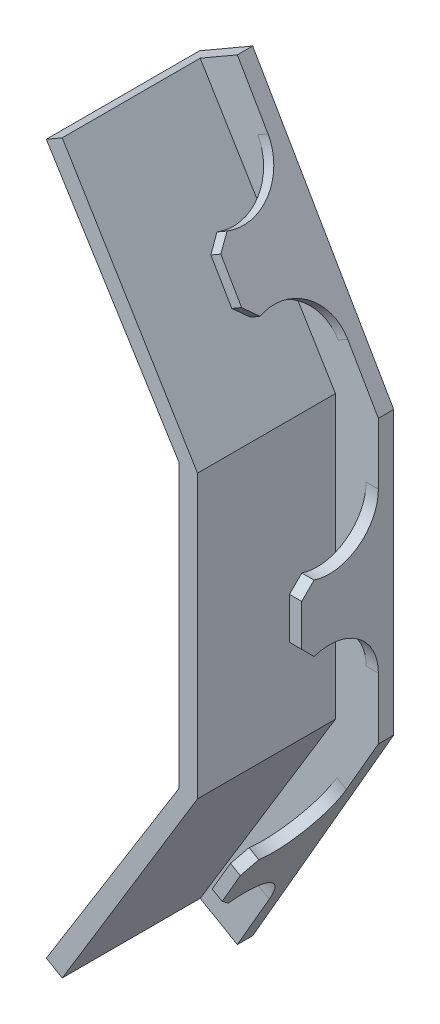
ISO-10303-21;
HEADER;
FILE_DESCRIPTION(('STEP AP214'),'2;1');
FILE_NAME('part.step','',(''),(''),'','','');
FILE_SCHEMA(('AUTOMOTIVE_DESIGN { 1 0 10303 214 1 1 1 1 }'));
ENDSEC;
DATA;
#1=APPLICATION_CONTEXT('core data for automotive mechanical design processes');
#2=APPLICATION_PROTOCOL_DEFINITION('international standard','automotive_design',2000,#1);
#3=PRODUCT_CONTEXT('',#1,'mechanical');
#4=PRODUCT('Part','Part','',(#3));
#5=PRODUCT_RELATED_PRODUCT_CATEGORY('part','',(#4));
#6=PRODUCT_DEFINITION_FORMATION('','',#4);
#7=PRODUCT_DEFINITION_CONTEXT('part definition',#1,'design');
#8=PRODUCT_DEFINITION('design','',#6,#7);
#9=PRODUCT_DEFINITION_SHAPE('','',#8);
#10=(LENGTH_UNIT() NAMED_UNIT(*) SI_UNIT(.MILLI.,.METRE.));
#11=(NAMED_UNIT(*) PLANE_ANGLE_UNIT() SI_UNIT($,.RADIAN.));
#12=(NAMED_UNIT(*) SI_UNIT($,.STERADIAN.) SOLID_ANGLE_UNIT());
#13=UNCERTAINTY_MEASURE_WITH_UNIT(LENGTH_MEASURE(1.E-05),#10,'distance_accuracy_value','');
#14=(GEOMETRIC_REPRESENTATION_CONTEXT(3) GLOBAL_UNCERTAINTY_ASSIGNED_CONTEXT((#13)) GLOBAL_UNIT_ASSIGNED_CONTEXT((#10,
#11,#12)) REPRESENTATION_CONTEXT('',''));
#15=CARTESIAN_POINT('',(0.,0.,0.));
#16=DIRECTION('',(0.,0.,1.));
#17=DIRECTION('',(1.,0.,0.));
#18=AXIS2_PLACEMENT_3D('',#15,#16,#17);
#19=CARTESIAN_POINT('',(0.,0.,25.));
#20=DIRECTION('',(0.866025403784438,-0.500000000000001,0.));
#21=DIRECTION('',(0.500000000000001,0.866025403784438,0.));
#22=AXIS2_PLACEMENT_3D('',#19,#20,#21);
#23=PLANE('',#22);
#24=DIRECTION('',(0.500000000000001,0.866025403784438,0.));
#25=VECTOR('',#24,1.);
#26=CARTESIAN_POINT('',(0.,0.,2.5));
#27=LINE('',#26,#25);
#28=CARTESIAN_POINT('',(-5.21209125149789,-9.02760686127958,2.5));
#29=VERTEX_POINT('',#28);
#30=CARTESIAN_POINT('',(0.,0.,2.5));
#31=VERTEX_POINT('',#30);
#32=EDGE_CURVE('E236',#29,#31,#27,.T.);
#33=ORIENTED_EDGE('',*,*,#32,.F.);
#34=CARTESIAN_POINT('',(-5.2120912514979,-9.02760686127957,10.5));
#35=DIRECTION('',(0.866025403784438,-0.500000000000001,0.));
#36=DIRECTION('',(0.500000000000001,0.866025403784438,0.));
#37=AXIS2_PLACEMENT_3D('',#34,#35,#36);
#38=CIRCLE('',#37,8.);
#39=CARTESIAN_POINT('',(-9.01361981272945,-15.6120474757568,12.9886788448016));
#40=VERTEX_POINT('',#39);
#41=EDGE_CURVE('E248',#29,#40,#38,.F.);
#42=ORIENTED_EDGE('',*,*,#41,.T.);
#43=DIRECTION('',(-0.353553390593275,-0.612372435695795,0.707106781186547));
#44=VECTOR('',#43,1.);
#45=CARTESIAN_POINT('',(-1.2596401951643,-2.18176081728054,-2.5192803903286));
#46=LINE('',#45,#44);
#47=CARTESIAN_POINT('',(-10.0192803903286,-17.3539026913277,15.));
#48=VERTEX_POINT('',#47);
#49=EDGE_CURVE('E246',#40,#48,#46,.T.);
#50=ORIENTED_EDGE('',*,*,#49,.T.);
#51=DIRECTION('',(0.500000000000001,0.866025403784438,0.));
#52=VECTOR('',#51,1.);
#53=CARTESIAN_POINT('',(0.,0.,15.));
#54=LINE('',#53,#52);
#55=CARTESIAN_POINT('',(-12.9807196096714,-22.4832658827565,15.));
#56=VERTEX_POINT('',#55);
#57=EDGE_CURVE('E275',#56,#48,#54,.T.);
#58=ORIENTED_EDGE('',*,*,#57,.F.);
#59=DIRECTION('',(0.353553390593275,0.612372435695795,0.707106781186547));
#60=VECTOR('',#59,1.);
#61=CARTESIAN_POINT('',(-10.2403598048357,-17.7368234697615,20.4807196096714));
#62=LINE('',#61,#60);
#63=CARTESIAN_POINT('',(-13.9863801872706,-24.2251210983273,12.9886788448016));
#64=VERTEX_POINT('',#63);
#65=EDGE_CURVE('E267',#64,#56,#62,.T.);
#66=ORIENTED_EDGE('',*,*,#65,.F.);
#67=CARTESIAN_POINT('',(-17.7879087485022,-30.8095617128046,10.5));
#68=DIRECTION('',(0.866025403784438,-0.500000000000001,0.));
#69=DIRECTION('',(0.500000000000001,0.866025403784438,0.));
#70=AXIS2_PLACEMENT_3D('',#67,#68,#69);
#71=CIRCLE('',#70,8.);
#72=CARTESIAN_POINT('',(-17.7879087485022,-30.8095617128046,2.49999999999999));
#73=VERTEX_POINT('',#72);
#74=EDGE_CURVE('E262',#73,#64,#71,.T.);
#75=ORIENTED_EDGE('',*,*,#74,.F.);
#76=DIRECTION('',(-0.500000000000001,-0.866025403784438,0.));
#77=VECTOR('',#76,1.);
#78=CARTESIAN_POINT('',(0.,0.,2.49999999999996));
#79=LINE('',#78,#77);
#80=CARTESIAN_POINT('',(-23.0000000000001,-39.8371685740841,2.5));
#81=VERTEX_POINT('',#80);
#82=EDGE_CURVE('E261',#73,#81,#79,.T.);
#83=ORIENTED_EDGE('',*,*,#82,.T.);
#84=DIRECTION('',(0.,0.,-1.));
#85=VECTOR('',#84,1.);
#86=CARTESIAN_POINT('',(-23.0000000000001,-39.8371685740841,25.));
#87=LINE('',#86,#85);
#88=CARTESIAN_POINT('',(-23.0000000000001,-39.8371685740841,0.));
#89=VERTEX_POINT('',#88);
#90=EDGE_CURVE('E421',#81,#89,#87,.T.);
#91=ORIENTED_EDGE('',*,*,#90,.T.);
#92=DIRECTION('',(-0.500000000000001,-0.866025403784438,0.));
#93=VECTOR('',#92,1.);
#94=CARTESIAN_POINT('',(0.,0.,0.));
#95=LINE('',#94,#93);
#96=CARTESIAN_POINT('',(0.,0.,0.));
#97=VERTEX_POINT('',#96);
#98=EDGE_CURVE('E405',#97,#89,#95,.T.);
#99=ORIENTED_EDGE('',*,*,#98,.F.);
#100=DIRECTION('',(0.,0.,-1.));
#101=VECTOR('',#100,1.);
#102=CARTESIAN_POINT('',(0.,0.,25.));
#103=LINE('',#102,#101);
#104=EDGE_CURVE('E257',#31,#97,#103,.T.);
#105=ORIENTED_EDGE('',*,*,#104,.F.);
#106=EDGE_LOOP('',(#33,#42,#50,#58,#66,#75,#83,#91,#99,#105));
#107=FACE_BOUND('',#106,.T.);
#108=ADVANCED_FACE('F39',(#107),#23,.T.);
#109=CARTESIAN_POINT('',(-24.7320508075689,-38.8371685740841,2.5));
#110=DIRECTION('',(0.86303289117112,-0.505147729636407,0.));
#111=DIRECTION('',(0.505147729636407,0.863032891171121,0.));
#112=AXIS2_PLACEMENT_3D('',#109,#110,#111);
#113=PLANE('',#112);
#114=CARTESIAN_POINT('',(-6.76068878839782,-8.13352365648401,10.5));
#115=DIRECTION('',(0.86303289117112,-0.505147729636407,0.));
#116=DIRECTION('',(0.505147729636407,0.863032891171121,0.));
#117=AXIS2_PLACEMENT_3D('',#114,#115,#116);
#118=ELLIPSE('',#117,8.00014181952266,8.);
#119=CARTESIAN_POINT('',(-6.76068878839782,-8.13352365648401,2.5));
#120=VERTEX_POINT('',#119);
#121=CARTESIAN_POINT('',(-10.6014239173018,-14.6953283485616,12.9886788448016));
#122=VERTEX_POINT('',#121);
#123=EDGE_CURVE('E286',#120,#122,#118,.F.);
#124=ORIENTED_EDGE('',*,*,#123,.F.);
#125=DIRECTION('',(0.505147729636407,0.863032891171121,0.));
#126=VECTOR('',#125,1.);
#127=CARTESIAN_POINT('',(-24.7320508075689,-38.8371685740841,2.5));
#128=LINE('',#127,#126);
#129=CARTESIAN_POINT('',(-19.4662053345585,-29.8405967270649,2.49999999999999));
#130=VERTEX_POINT('',#129);
#131=EDGE_CURVE('E245',#130,#120,#128,.T.);
#132=ORIENTED_EDGE('',*,*,#131,.F.);
#133=CARTESIAN_POINT('',(-19.4662053345585,-29.8405967270649,10.5));
#134=DIRECTION('',(0.86303289117112,-0.505147729636407,0.));
#135=DIRECTION('',(0.505147729636407,0.863032891171121,0.));
#136=AXIS2_PLACEMENT_3D('',#133,#134,#135);
#137=ELLIPSE('',#136,8.00014181952266,8.);
#138=CARTESIAN_POINT('',(-15.6254702056545,-23.2787920349874,12.9886788448016));
#139=VERTEX_POINT('',#138);
#140=EDGE_CURVE('E280',#130,#139,#137,.T.);
#141=ORIENTED_EDGE('',*,*,#140,.T.);
#142=DIRECTION('',(0.357196551147009,0.61026181880426,0.707100513617688));
#143=VECTOR('',#142,1.);
#144=CARTESIAN_POINT('',(-22.8280073763306,-35.5841556216954,-1.26934720942954));
#145=LINE('',#144,#143);
#146=CARTESIAN_POINT('',(-14.6094378792032,-21.5429249514082,15.));
#147=VERTEX_POINT('',#146);
#148=EDGE_CURVE('E469',#139,#147,#145,.T.);
#149=ORIENTED_EDGE('',*,*,#148,.T.);
#150=DIRECTION('',(0.505147729636407,0.863032891171121,0.));
#151=VECTOR('',#150,1.);
#152=CARTESIAN_POINT('',(-24.7320508075689,-38.8371685740841,15.));
#153=LINE('',#152,#151);
#154=CARTESIAN_POINT('',(-11.6174562437531,-16.4311954321407,15.));
#155=VERTEX_POINT('',#154);
#156=EDGE_CURVE('E46',#147,#155,#153,.T.);
#157=ORIENTED_EDGE('',*,*,#156,.T.);
#158=DIRECTION('',(-0.357196551147009,-0.61026181880426,0.707100513617688));
#159=VECTOR('',#158,1.);
#160=CARTESIAN_POINT('',(-15.0176964589955,-22.2404250326561,21.7310605180841));
#161=LINE('',#160,#159);
#162=EDGE_CURVE('E11',#122,#155,#161,.T.);
#163=ORIENTED_EDGE('',*,*,#162,.F.);
#164=EDGE_LOOP('',(#124,#132,#141,#149,#157,#163));
#165=FACE_BOUND('',#164,.T.);
#166=ADVANCED_FACE('F471',(#165),#113,.F.);
#167=CARTESIAN_POINT('',(-24.7320508075689,84.8371685740841,2.5));
#168=DIRECTION('',(0.86303289117112,0.505147729636407,0.));
#169=DIRECTION('',(-0.505147729636407,0.863032891171121,0.));
#170=AXIS2_PLACEMENT_3D('',#167,#168,#169);
#171=PLANE('',#170);
#172=CARTESIAN_POINT('',(-19.6804839614425,76.2066866687321,10.5));
#173=DIRECTION('',(0.86303289117112,0.505147729636407,0.));
#174=DIRECTION('',(0.505147729636407,-0.863032891171121,0.));
#175=AXIS2_PLACEMENT_3D('',#172,#173,#174);
#176=ELLIPSE('',#175,8.00014181952265,7.99999999999999);
#177=CARTESIAN_POINT('',(-19.6804839614425,76.2066866687321,2.49999999999999));
#178=VERTEX_POINT('',#177);
#179=CARTESIAN_POINT('',(-15.8397488325385,69.6448819766546,12.9886788448016));
#180=VERTEX_POINT('',#179);
#181=EDGE_CURVE('E321',#178,#180,#176,.F.);
#182=ORIENTED_EDGE('',*,*,#181,.F.);
#183=DIRECTION('',(-0.505147729636407,0.863032891171121,0.));
#184=VECTOR('',#183,1.);
#185=CARTESIAN_POINT('',(-24.7320508075689,84.8371685740841,2.5));
#186=LINE('',#185,#184);
#187=CARTESIAN_POINT('',(-6.5464101615138,53.7674337148168,2.5));
#188=VERTEX_POINT('',#187);
#189=EDGE_CURVE('E372',#188,#178,#186,.T.);
#190=ORIENTED_EDGE('',*,*,#189,.F.);
#191=CARTESIAN_POINT('',(-6.5464101615138,53.7674337148168,10.5));
#192=DIRECTION('',(0.86303289117112,0.505147729636407,0.));
#193=DIRECTION('',(0.505147729636407,-0.863032891171121,0.));
#194=AXIS2_PLACEMENT_3D('',#191,#192,#193);
#195=ELLIPSE('',#194,8.00014181952266,8.);
#196=CARTESIAN_POINT('',(-10.3871452904178,60.3292384068944,12.9886788448016));
#197=VERTEX_POINT('',#196);
#198=EDGE_CURVE('E309',#188,#197,#195,.T.);
#199=ORIENTED_EDGE('',*,*,#198,.T.);
#200=DIRECTION('',(-0.357196551147009,0.610261818804259,0.70710051361769));
#201=VECTOR('',#200,1.);
#202=CARTESIAN_POINT('',(-14.9105590448424,68.0573833067125,21.9431555293836));
#203=LINE('',#202,#201);
#204=CARTESIAN_POINT('',(-11.4031776168691,62.0651054904735,15.));
#205=VERTEX_POINT('',#204);
#206=EDGE_CURVE('E450',#197,#205,#203,.T.);
#207=ORIENTED_EDGE('',*,*,#206,.T.);
#208=DIRECTION('',(-0.505147729636407,0.863032891171121,0.));
#209=VECTOR('',#208,1.);
#210=CARTESIAN_POINT('',(-24.7320508075689,84.8371685740841,15.));
#211=LINE('',#210,#209);
#212=CARTESIAN_POINT('',(-14.8237165060872,67.9090148930754,15.));
#213=VERTEX_POINT('',#212);
#214=EDGE_CURVE('E461',#205,#213,#211,.T.);
#215=ORIENTED_EDGE('',*,*,#214,.T.);
#216=DIRECTION('',(0.35719655114701,-0.610261818804261,0.707100513617687));
#217=VECTOR('',#216,1.);
#218=CARTESIAN_POINT('',(-22.9351447904837,81.767197347639,-1.05725219812995));
#219=LINE('',#218,#217);
#220=EDGE_CURVE('E466',#180,#213,#219,.T.);
#221=ORIENTED_EDGE('',*,*,#220,.F.);
#222=EDGE_LOOP('',(#182,#190,#199,#207,#215,#221));
#223=FACE_BOUND('',#222,.T.);
#224=ADVANCED_FACE('F503',(#223),#171,.F.);
#225=CARTESIAN_POINT('',(0.,0.,25.));
#226=DIRECTION('',(-1.,0.,0.));
#227=DIRECTION('',(0.,0.,1.));
#228=AXIS2_PLACEMENT_3D('',#225,#226,#227);
#229=PLANE('',#228);
#230=CARTESIAN_POINT('',(0.,36.,10.5));
#231=DIRECTION('',(1.,0.,0.));
#232=DIRECTION('',(0.,0.,1.));
#233=AXIS2_PLACEMENT_3D('',#230,#231,#232);
#234=CIRCLE('',#233,8.);
#235=CARTESIAN_POINT('',(0.,28.3969428775369,12.9886788448016));
#236=VERTEX_POINT('',#235);
#237=CARTESIAN_POINT('',(0.,36.,2.5));
#238=VERTEX_POINT('',#237);
#239=EDGE_CURVE('E323',#236,#238,#234,.T.);
#240=ORIENTED_EDGE('',*,*,#239,.F.);
#241=DIRECTION('',(0.,0.707106781186547,-0.707106781186547));
#242=VECTOR('',#241,1.);
#243=CARTESIAN_POINT('',(0.,28.3969428775369,12.9886788448016));
#244=LINE('',#243,#242);
#245=CARTESIAN_POINT('',(0.,26.3856217223385,15.));
#246=VERTEX_POINT('',#245);
#247=EDGE_CURVE('E327',#246,#236,#244,.T.);
#248=ORIENTED_EDGE('',*,*,#247,.F.);
#249=DIRECTION('',(0.,1.,0.));
#250=VECTOR('',#249,1.);
#251=CARTESIAN_POINT('',(0.,19.6143782776615,15.));
#252=LINE('',#251,#250);
#253=CARTESIAN_POINT('',(0.,19.6143782776615,15.));
#254=VERTEX_POINT('',#253);
#255=EDGE_CURVE('E354',#254,#246,#252,.T.);
#256=ORIENTED_EDGE('',*,*,#255,.F.);
#257=DIRECTION('',(0.,0.707106781186547,0.707106781186547));
#258=VECTOR('',#257,1.);
#259=CARTESIAN_POINT('',(0.,17.6030571224631,12.9886788448016));
#260=LINE('',#259,#258);
#261=CARTESIAN_POINT('',(0.,17.6030571224631,12.9886788448016));
#262=VERTEX_POINT('',#261);
#263=EDGE_CURVE('E353',#262,#254,#260,.T.);
#264=ORIENTED_EDGE('',*,*,#263,.F.);
#265=CARTESIAN_POINT('',(0.,10.,10.5));
#266=DIRECTION('',(1.,0.,0.));
#267=DIRECTION('',(0.,0.,-1.));
#268=AXIS2_PLACEMENT_3D('',#265,#266,#267);
#269=CIRCLE('',#268,8.);
#270=CARTESIAN_POINT('',(0.,10.,2.5));
#271=VERTEX_POINT('',#270);
#272=EDGE_CURVE('E346',#271,#262,#269,.T.);
#273=ORIENTED_EDGE('',*,*,#272,.F.);
#274=DIRECTION('',(0.,1.,0.));
#275=VECTOR('',#274,1.);
#276=CARTESIAN_POINT('',(0.,0.,2.5));
#277=LINE('',#276,#275);
#278=EDGE_CURVE('E347',#31,#271,#277,.T.);
#279=ORIENTED_EDGE('',*,*,#278,.F.);
#280=ORIENTED_EDGE('',*,*,#104,.T.);
#281=DIRECTION('',(0.,1.,0.));
#282=VECTOR('',#281,1.);
#283=CARTESIAN_POINT('',(0.,0.,0.));
#284=LINE('',#283,#282);
#285=CARTESIAN_POINT('',(0.,46.,0.));
#286=VERTEX_POINT('',#285);
#287=EDGE_CURVE('E412',#97,#286,#284,.T.);
#288=ORIENTED_EDGE('',*,*,#287,.T.);
#289=DIRECTION('',(0.,0.,-1.));
#290=VECTOR('',#289,1.);
#291=CARTESIAN_POINT('',(0.,46.,25.));
#292=LINE('',#291,#290);
#293=CARTESIAN_POINT('',(0.,46.,2.5));
#294=VERTEX_POINT('',#293);
#295=EDGE_CURVE('E446',#294,#286,#292,.T.);
#296=ORIENTED_EDGE('',*,*,#295,.F.);
#297=DIRECTION('',(0.,1.,0.));
#298=VECTOR('',#297,1.);
#299=CARTESIAN_POINT('',(0.,36.,2.5));
#300=LINE('',#299,#298);
#301=EDGE_CURVE('E344',#238,#294,#300,.T.);
#302=ORIENTED_EDGE('',*,*,#301,.F.);
#303=EDGE_LOOP('',(#240,#248,#256,#264,#273,#279,#280,#288,#296,#302));
#304=FACE_BOUND('',#303,.T.);
#305=ADVANCED_FACE('F507',(#304),#229,.F.);
#306=CARTESIAN_POINT('',(-23.0000000000001,-39.8371685740841,25.));
#307=DIRECTION('',(-0.5,-0.866025403784438,0.));
#308=DIRECTION('',(0.866025403784439,-0.5,0.));
#309=AXIS2_PLACEMENT_3D('',#306,#307,#308);
#310=PLANE('',#309);
#311=ORIENTED_EDGE('',*,*,#90,.F.);
#312=DIRECTION('',(0.866025403784438,-0.5,0.));
#313=VECTOR('',#312,1.);
#314=CARTESIAN_POINT('',(-24.7320508075689,-38.8371685740841,2.5));
#315=LINE('',#314,#313);
#316=CARTESIAN_POINT('',(-29.0621778264911,-36.3371685740841,2.5));
#317=VERTEX_POINT('',#316);
#318=EDGE_CURVE('E388',#317,#81,#315,.T.);
#319=ORIENTED_EDGE('',*,*,#318,.F.);
#320=DIRECTION('',(0.,0.,1.));
#321=VECTOR('',#320,1.);
#322=CARTESIAN_POINT('',(-29.0621778264911,-36.3371685740841,2.5));
#323=LINE('',#322,#321);
#324=CARTESIAN_POINT('',(-29.0621778264911,-36.3371685740841,25.));
#325=VERTEX_POINT('',#324);
#326=EDGE_CURVE('E398',#317,#325,#323,.T.);
#327=ORIENTED_EDGE('',*,*,#326,.T.);
#328=DIRECTION('',(-0.866025403784438,0.5,0.));
#329=VECTOR('',#328,1.);
#330=CARTESIAN_POINT('',(-23.0000000000001,-39.8371685740841,25.));
#331=LINE('',#330,#329);
#332=CARTESIAN_POINT('',(-31.6602540378444,-34.8371685740842,25.));
#333=VERTEX_POINT('',#332);
#334=EDGE_CURVE('E409',#325,#333,#331,.T.);
#335=ORIENTED_EDGE('',*,*,#334,.T.);
#336=DIRECTION('',(0.,0.,-1.));
#337=VECTOR('',#336,1.);
#338=CARTESIAN_POINT('',(-31.6602540378444,-34.8371685740842,25.));
#339=LINE('',#338,#337);
#340=CARTESIAN_POINT('',(-31.6602540378444,-34.8371685740842,0.));
#341=VERTEX_POINT('',#340);
#342=EDGE_CURVE('E456',#333,#341,#339,.T.);
#343=ORIENTED_EDGE('',*,*,#342,.T.);
#344=DIRECTION('',(-0.866025403784438,0.5,0.));
#345=VECTOR('',#344,1.);
#346=CARTESIAN_POINT('',(-23.0000000000001,-39.8371685740841,0.));
#347=LINE('',#346,#345);
#348=EDGE_CURVE('E426',#89,#341,#347,.T.);
#349=ORIENTED_EDGE('',*,*,#348,.F.);
#350=EDGE_LOOP('',(#311,#319,#327,#335,#343,#349));
#351=FACE_BOUND('',#350,.T.);
#352=ADVANCED_FACE('F534',(#351),#310,.T.);
#353=CARTESIAN_POINT('',(0.,0.,25.));
#354=DIRECTION('',(0.,0.,-1.));
#355=DIRECTION('',(-1.,0.,0.));
#356=AXIS2_PLACEMENT_3D('',#353,#354,#355);
#357=PLANE('',#356);
#358=DIRECTION('',(0.518983728498553,-0.854784118683624,0.));
#359=VECTOR('',#358,1.);
#360=CARTESIAN_POINT('',(-7.,46.,25.));
#361=LINE('',#360,#359);
#362=CARTESIAN_POINT('',(-29.0621778264911,82.3371685740841,25.));
#363=VERTEX_POINT('',#362);
#364=CARTESIAN_POINT('',(-7.,46.,25.));
#365=VERTEX_POINT('',#364);
#366=EDGE_CURVE('E363',#363,#365,#361,.T.);
#367=ORIENTED_EDGE('',*,*,#366,.F.);
#368=DIRECTION('',(-0.866025403784438,-0.500000000000001,0.));
#369=VECTOR('',#368,1.);
#370=CARTESIAN_POINT('',(-23.0000000000001,85.8371685740841,25.));
#371=LINE('',#370,#369);
#372=CARTESIAN_POINT('',(-31.6602540378444,80.8371685740842,25.));
#373=VERTEX_POINT('',#372);
#374=EDGE_CURVE('E423',#363,#373,#371,.T.);
#375=ORIENTED_EDGE('',*,*,#374,.T.);
#376=DIRECTION('',(-0.528017054131773,0.849233766725043,0.));
#377=VECTOR('',#376,1.);
#378=CARTESIAN_POINT('',(-10.,46.,25.));
#379=LINE('',#378,#377);
#380=CARTESIAN_POINT('',(-10.,46.,25.));
#381=VERTEX_POINT('',#380);
#382=EDGE_CURVE('E416',#381,#373,#379,.T.);
#383=ORIENTED_EDGE('',*,*,#382,.F.);
#384=DIRECTION('',(0.,1.,0.));
#385=VECTOR('',#384,1.);
#386=CARTESIAN_POINT('',(-10.,0.,25.));
#387=LINE('',#386,#385);
#388=CARTESIAN_POINT('',(-10.,0.,25.));
#389=VERTEX_POINT('',#388);
#390=EDGE_CURVE('E415',#389,#381,#387,.T.);
#391=ORIENTED_EDGE('',*,*,#390,.F.);
#392=DIRECTION('',(-0.528017054131773,-0.849233766725043,0.));
#393=VECTOR('',#392,1.);
#394=CARTESIAN_POINT('',(-10.,0.,25.));
#395=LINE('',#394,#393);
#396=EDGE_CURVE('E411',#389,#333,#395,.T.);
#397=ORIENTED_EDGE('',*,*,#396,.T.);
#398=ORIENTED_EDGE('',*,*,#334,.F.);
#399=DIRECTION('',(-0.518983728498553,-0.854784118683624,0.));
#400=VECTOR('',#399,1.);
#401=CARTESIAN_POINT('',(-7.,0.,25.));
#402=LINE('',#401,#400);
#403=CARTESIAN_POINT('',(-7.,0.,25.));
#404=VERTEX_POINT('',#403);
#405=EDGE_CURVE('E374',#404,#325,#402,.T.);
#406=ORIENTED_EDGE('',*,*,#405,.F.);
#407=DIRECTION('',(0.,-1.,0.));
#408=VECTOR('',#407,1.);
#409=CARTESIAN_POINT('',(-7.,0.,25.));
#410=LINE('',#409,#408);
#411=EDGE_CURVE('E392',#365,#404,#410,.T.);
#412=ORIENTED_EDGE('',*,*,#411,.F.);
#413=EDGE_LOOP('',(#367,#375,#383,#391,#397,#398,#406,#412));
#414=FACE_BOUND('',#413,.T.);
#415=ADVANCED_FACE('F529',(#414),#357,.F.);
#416=CARTESIAN_POINT('',(0.,46.,25.));
#417=DIRECTION('',(-0.866025403784438,-0.500000000000001,0.));
#418=DIRECTION('',(0.500000000000001,-0.866025403784438,0.));
#419=AXIS2_PLACEMENT_3D('',#416,#417,#418);
#420=PLANE('',#419);
#421=DIRECTION('',(-0.500000000000001,0.866025403784438,0.));
#422=VECTOR('',#421,1.);
#423=CARTESIAN_POINT('',(19.9185842870421,11.5000000000001,2.49999999999993));
#424=LINE('',#423,#422);
#425=CARTESIAN_POINT('',(-18.,77.1769145362398,2.49999999999999));
#426=VERTEX_POINT('',#425);
#427=CARTESIAN_POINT('',(-23.,85.8371685740842,2.5));
#428=VERTEX_POINT('',#427);
#429=EDGE_CURVE('E292',#426,#428,#424,.T.);
#430=ORIENTED_EDGE('',*,*,#429,.F.);
#431=CARTESIAN_POINT('',(-18.,77.1769145362398,10.5));
#432=DIRECTION('',(0.866025403784438,0.500000000000001,0.));
#433=DIRECTION('',(-0.500000000000001,0.866025403784438,0.));
#434=AXIS2_PLACEMENT_3D('',#431,#432,#433);
#435=CIRCLE('',#434,7.99999999999999);
#436=CARTESIAN_POINT('',(-14.1984714387685,70.5924739217626,12.9886788448016));
#437=VERTEX_POINT('',#436);
#438=EDGE_CURVE('E289',#426,#437,#435,.F.);
#439=ORIENTED_EDGE('',*,*,#438,.T.);
#440=DIRECTION('',(0.353553390593276,-0.612372435695796,0.707106781186545));
#441=VECTOR('',#440,1.);
#442=CARTESIAN_POINT('',(-0.387113287063451,46.670499881479,40.6113951482114));
#443=LINE('',#442,#441);
#444=CARTESIAN_POINT('',(-13.1928108611693,68.8506187061917,15.));
#445=VERTEX_POINT('',#444);
#446=EDGE_CURVE('E303',#437,#445,#443,.T.);
#447=ORIENTED_EDGE('',*,*,#446,.T.);
#448=DIRECTION('',(-0.500000000000001,0.866025403784438,0.));
#449=VECTOR('',#448,1.);
#450=CARTESIAN_POINT('',(19.9185842870421,11.5000000000001,15.0000000000001));
#451=LINE('',#450,#449);
#452=CARTESIAN_POINT('',(-9.80718913883073,62.9865498678925,15.));
#453=VERTEX_POINT('',#452);
#454=EDGE_CURVE('E301',#453,#445,#451,.T.);
#455=ORIENTED_EDGE('',*,*,#454,.F.);
#456=DIRECTION('',(-0.353553390593274,0.612372435695793,0.707106781186548));
#457=VECTOR('',#456,1.);
#458=CARTESIAN_POINT('',(8.80569757410568,30.7480844055631,-22.2257734258728));
#459=LINE('',#458,#457);
#460=CARTESIAN_POINT('',(-8.80152856123154,61.2446946523217,12.9886788448016));
#461=VERTEX_POINT('',#460);
#462=EDGE_CURVE('E296',#461,#453,#459,.T.);
#463=ORIENTED_EDGE('',*,*,#462,.F.);
#464=CARTESIAN_POINT('',(-4.99999999999998,54.6602540378444,10.5));
#465=DIRECTION('',(0.866025403784438,0.500000000000001,0.));
#466=DIRECTION('',(-0.500000000000001,0.866025403784438,0.));
#467=AXIS2_PLACEMENT_3D('',#464,#465,#466);
#468=CIRCLE('',#467,8.);
#469=CARTESIAN_POINT('',(-4.99999999999999,54.6602540378444,2.5));
#470=VERTEX_POINT('',#469);
#471=EDGE_CURVE('E298',#470,#461,#468,.T.);
#472=ORIENTED_EDGE('',*,*,#471,.F.);
#473=DIRECTION('',(0.500000000000001,-0.866025403784438,0.));
#474=VECTOR('',#473,1.);
#475=CARTESIAN_POINT('',(19.9185842870421,11.5000000000001,2.50000000000001));
#476=LINE('',#475,#474);
#477=EDGE_CURVE('E294',#470,#294,#476,.T.);
#478=ORIENTED_EDGE('',*,*,#477,.T.);
#479=ORIENTED_EDGE('',*,*,#295,.T.);
#480=DIRECTION('',(-0.500000000000001,0.866025403784438,0.));
#481=VECTOR('',#480,1.);
#482=CARTESIAN_POINT('',(0.,46.,0.));
#483=LINE('',#482,#481);
#484=CARTESIAN_POINT('',(-23.0000000000001,85.8371685740841,0.));
#485=VERTEX_POINT('',#484);
#486=EDGE_CURVE('E442',#286,#485,#483,.T.);
#487=ORIENTED_EDGE('',*,*,#486,.T.);
#488=DIRECTION('',(0.,0.,-1.));
#489=VECTOR('',#488,1.);
#490=CARTESIAN_POINT('',(-23.0000000000001,85.8371685740841,25.));
#491=LINE('',#490,#489);
#492=EDGE_CURVE('E447',#428,#485,#491,.T.);
#493=ORIENTED_EDGE('',*,*,#492,.F.);
#494=EDGE_LOOP('',(#430,#439,#447,#455,#463,#472,#478,#479,#487,#493));
#495=FACE_BOUND('',#494,.T.);
#496=ADVANCED_FACE('F531',(#495),#420,.F.);
#497=CARTESIAN_POINT('',(-23.0000000000001,85.8371685740841,25.));
#498=DIRECTION('',(0.500000000000001,-0.866025403784438,0.));
#499=DIRECTION('',(0.866025403784438,0.500000000000001,0.));
#500=AXIS2_PLACEMENT_3D('',#497,#498,#499);
#501=PLANE('',#500);
#502=DIRECTION('',(-0.866025403784438,-0.5,0.));
#503=VECTOR('',#502,1.);
#504=CARTESIAN_POINT('',(-24.7320508075689,84.8371685740841,2.5));
#505=LINE('',#504,#503);
#506=CARTESIAN_POINT('',(-29.0621778264911,82.3371685740841,2.5));
#507=VERTEX_POINT('',#506);
#508=EDGE_CURVE('E378',#428,#507,#505,.T.);
#509=ORIENTED_EDGE('',*,*,#508,.F.);
#510=ORIENTED_EDGE('',*,*,#492,.T.);
#511=DIRECTION('',(-0.866025403784438,-0.500000000000001,0.));
#512=VECTOR('',#511,1.);
#513=CARTESIAN_POINT('',(-23.0000000000001,85.8371685740841,0.));
#514=LINE('',#513,#512);
#515=CARTESIAN_POINT('',(-31.6602540378444,80.8371685740842,0.));
#516=VERTEX_POINT('',#515);
#517=EDGE_CURVE('E437',#485,#516,#514,.T.);
#518=ORIENTED_EDGE('',*,*,#517,.T.);
#519=DIRECTION('',(0.,0.,-1.));
#520=VECTOR('',#519,1.);
#521=CARTESIAN_POINT('',(-31.6602540378444,80.8371685740842,25.));
#522=LINE('',#521,#520);
#523=EDGE_CURVE('E452',#373,#516,#522,.T.);
#524=ORIENTED_EDGE('',*,*,#523,.F.);
#525=ORIENTED_EDGE('',*,*,#374,.F.);
#526=DIRECTION('',(0.,0.,1.));
#527=VECTOR('',#526,1.);
#528=CARTESIAN_POINT('',(-29.0621778264911,82.3371685740841,2.5));
#529=LINE('',#528,#527);
#530=EDGE_CURVE('E391',#507,#363,#529,.T.);
#531=ORIENTED_EDGE('',*,*,#530,.F.);
#532=EDGE_LOOP('',(#509,#510,#518,#524,#525,#531));
#533=FACE_BOUND('',#532,.T.);
#534=ADVANCED_FACE('F542',(#533),#501,.F.);
#535=CARTESIAN_POINT('',(-10.,46.,25.));
#536=DIRECTION('',(-0.849233766725043,-0.528017054131773,0.));
#537=DIRECTION('',(0.528017054131773,-0.849233766725043,0.));
#538=AXIS2_PLACEMENT_3D('',#535,#536,#537);
#539=PLANE('',#538);
#540=DIRECTION('',(-0.528017054131773,0.849233766725043,0.));
#541=VECTOR('',#540,1.);
#542=CARTESIAN_POINT('',(-10.,46.,0.));
#543=LINE('',#542,#541);
#544=CARTESIAN_POINT('',(-10.,46.,0.));
#545=VERTEX_POINT('',#544);
#546=EDGE_CURVE('E434',#545,#516,#543,.T.);
#547=ORIENTED_EDGE('',*,*,#546,.F.);
#548=DIRECTION('',(0.,0.,-1.));
#549=VECTOR('',#548,1.);
#550=CARTESIAN_POINT('',(-10.,46.,25.));
#551=LINE('',#550,#549);
#552=EDGE_CURVE('E453',#381,#545,#551,.T.);
#553=ORIENTED_EDGE('',*,*,#552,.F.);
#554=ORIENTED_EDGE('',*,*,#382,.T.);
#555=ORIENTED_EDGE('',*,*,#523,.T.);
#556=EDGE_LOOP('',(#547,#553,#554,#555));
#557=FACE_BOUND('',#556,.T.);
#558=ADVANCED_FACE('F547',(#557),#539,.T.);
#559=CARTESIAN_POINT('',(-10.,0.,25.));
#560=DIRECTION('',(-1.,0.,0.));
#561=DIRECTION('',(0.,0.,1.));
#562=AXIS2_PLACEMENT_3D('',#559,#560,#561);
#563=PLANE('',#562);
#564=CARTESIAN_POINT('',(-10.,15.,12.5));
#565=DIRECTION('',(-1.,0.,0.));
#566=DIRECTION('',(0.,0.,-1.));
#567=AXIS2_PLACEMENT_3D('',#564,#565,#566);
#568=CIRCLE('',#567,2.4);
#569=CARTESIAN_POINT('',(-10.,15.,10.1));
#570=VERTEX_POINT('',#569);
#571=EDGE_CURVE('E729',#570,#570,#568,.T.);
#572=ORIENTED_EDGE('',*,*,#571,.F.);
#573=EDGE_LOOP('',(#572));
#574=FACE_BOUND('',#573,.T.);
#575=CARTESIAN_POINT('',(-10.,31.,12.5));
#576=DIRECTION('',(-1.,0.,0.));
#577=DIRECTION('',(0.,0.,1.));
#578=AXIS2_PLACEMENT_3D('',#575,#576,#577);
#579=CIRCLE('',#578,2.4);
#580=CARTESIAN_POINT('',(-10.,31.,14.9));
#581=VERTEX_POINT('',#580);
#582=EDGE_CURVE('E736',#581,#581,#579,.T.);
#583=ORIENTED_EDGE('',*,*,#582,.F.);
#584=EDGE_LOOP('',(#583));
#585=FACE_BOUND('',#584,.T.);
#586=CARTESIAN_POINT('',(-10.,23.,12.5));
#587=DIRECTION('',(-1.,0.,0.));
#588=DIRECTION('',(0.,0.,1.));
#589=AXIS2_PLACEMENT_3D('',#586,#587,#588);
#590=CIRCLE('',#589,2.4);
#591=CARTESIAN_POINT('',(-10.,23.,14.9));
#592=VERTEX_POINT('',#591);
#593=EDGE_CURVE('E738',#592,#592,#590,.T.);
#594=ORIENTED_EDGE('',*,*,#593,.F.);
#595=EDGE_LOOP('',(#594));
#596=FACE_BOUND('',#595,.T.);
#597=DIRECTION('',(0.,1.,0.));
#598=VECTOR('',#597,1.);
#599=CARTESIAN_POINT('',(-10.,0.,0.));
#600=LINE('',#599,#598);
#601=CARTESIAN_POINT('',(-10.,0.,0.));
#602=VERTEX_POINT('',#601);
#603=EDGE_CURVE('E435',#602,#545,#600,.T.);
#604=ORIENTED_EDGE('',*,*,#603,.F.);
#605=DIRECTION('',(0.,0.,-1.));
#606=VECTOR('',#605,1.);
#607=CARTESIAN_POINT('',(-10.,0.,25.));
#608=LINE('',#607,#606);
#609=EDGE_CURVE('E457',#389,#602,#608,.T.);
#610=ORIENTED_EDGE('',*,*,#609,.F.);
#611=ORIENTED_EDGE('',*,*,#390,.T.);
#612=ORIENTED_EDGE('',*,*,#552,.T.);
#613=EDGE_LOOP('',(#604,#610,#611,#612));
#614=FACE_BOUND('',#613,.T.);
#615=ADVANCED_FACE('F555',(#574,#585,#596,#614),#563,.T.);
#616=CARTESIAN_POINT('',(-10.,0.,25.));
#617=DIRECTION('',(0.849233766725043,-0.528017054131773,0.));
#618=DIRECTION('',(0.528017054131773,0.849233766725043,0.));
#619=AXIS2_PLACEMENT_3D('',#616,#617,#618);
#620=PLANE('',#619);
#621=DIRECTION('',(-0.528017054131773,-0.849233766725043,0.));
#622=VECTOR('',#621,1.);
#623=CARTESIAN_POINT('',(-10.,0.,0.));
#624=LINE('',#623,#622);
#625=EDGE_CURVE('E427',#602,#341,#624,.T.);
#626=ORIENTED_EDGE('',*,*,#625,.T.);
#627=ORIENTED_EDGE('',*,*,#342,.F.);
#628=ORIENTED_EDGE('',*,*,#396,.F.);
#629=ORIENTED_EDGE('',*,*,#609,.T.);
#630=EDGE_LOOP('',(#626,#627,#628,#629));
#631=FACE_BOUND('',#630,.T.);
#632=ADVANCED_FACE('F538',(#631),#620,.F.);
#633=CARTESIAN_POINT('',(0.,0.,0.));
#634=DIRECTION('',(0.,0.,-1.));
#635=DIRECTION('',(-1.,0.,0.));
#636=AXIS2_PLACEMENT_3D('',#633,#634,#635);
#637=PLANE('',#636);
#638=ORIENTED_EDGE('',*,*,#98,.T.);
#639=ORIENTED_EDGE('',*,*,#348,.T.);
#640=ORIENTED_EDGE('',*,*,#625,.F.);
#641=ORIENTED_EDGE('',*,*,#603,.T.);
#642=ORIENTED_EDGE('',*,*,#546,.T.);
#643=ORIENTED_EDGE('',*,*,#517,.F.);
#644=ORIENTED_EDGE('',*,*,#486,.F.);
#645=ORIENTED_EDGE('',*,*,#287,.F.);
#646=EDGE_LOOP('',(#638,#639,#640,#641,#642,#643,#644,#645));
#647=FACE_BOUND('',#646,.T.);
#648=ADVANCED_FACE('F526',(#647),#637,.T.);
#649=CARTESIAN_POINT('',(-2.,0.,2.5));
#650=DIRECTION('',(1.,0.,0.));
#651=DIRECTION('',(0.,0.,-1.));
#652=AXIS2_PLACEMENT_3D('',#649,#650,#651);
#653=PLANE('',#652);
#654=DIRECTION('',(0.,0.707106781186547,-0.707106781186547));
#655=VECTOR('',#654,1.);
#656=CARTESIAN_POINT('',(-2.,28.3969428775369,12.9886788448016));
#657=LINE('',#656,#655);
#658=CARTESIAN_POINT('',(-2.,26.3856217223385,15.));
#659=VERTEX_POINT('',#658);
#660=CARTESIAN_POINT('',(-2.,28.3969428775369,12.9886788448016));
#661=VERTEX_POINT('',#660);
#662=EDGE_CURVE('E340',#659,#661,#657,.T.);
#663=ORIENTED_EDGE('',*,*,#662,.T.);
#664=CARTESIAN_POINT('',(-2.,36.,10.5));
#665=DIRECTION('',(1.,0.,0.));
#666=DIRECTION('',(0.,0.,1.));
#667=AXIS2_PLACEMENT_3D('',#664,#665,#666);
#668=CIRCLE('',#667,8.);
#669=CARTESIAN_POINT('',(-2.,36.,2.5));
#670=VERTEX_POINT('',#669);
#671=EDGE_CURVE('E322',#661,#670,#668,.T.);
#672=ORIENTED_EDGE('',*,*,#671,.T.);
#673=DIRECTION('',(0.,1.,0.));
#674=VECTOR('',#673,1.);
#675=CARTESIAN_POINT('',(-2.,0.,2.5));
#676=LINE('',#675,#674);
#677=CARTESIAN_POINT('',(-2.,10.,2.5));
#678=VERTEX_POINT('',#677);
#679=EDGE_CURVE('E371',#678,#670,#676,.T.);
#680=ORIENTED_EDGE('',*,*,#679,.F.);
#681=CARTESIAN_POINT('',(-2.,10.,10.5));
#682=DIRECTION('',(1.,0.,0.));
#683=DIRECTION('',(0.,0.,-1.));
#684=AXIS2_PLACEMENT_3D('',#681,#682,#683);
#685=CIRCLE('',#684,8.);
#686=CARTESIAN_POINT('',(-2.,17.6030571224631,12.9886788448016));
#687=VERTEX_POINT('',#686);
#688=EDGE_CURVE('E330',#678,#687,#685,.T.);
#689=ORIENTED_EDGE('',*,*,#688,.T.);
#690=DIRECTION('',(0.,0.707106781186547,0.707106781186547));
#691=VECTOR('',#690,1.);
#692=CARTESIAN_POINT('',(-2.,17.6030571224631,12.9886788448016));
#693=LINE('',#692,#691);
#694=CARTESIAN_POINT('',(-2.,19.6143782776615,15.));
#695=VERTEX_POINT('',#694);
#696=EDGE_CURVE('E332',#687,#695,#693,.T.);
#697=ORIENTED_EDGE('',*,*,#696,.T.);
#698=DIRECTION('',(0.,1.,0.));
#699=VECTOR('',#698,1.);
#700=CARTESIAN_POINT('',(-2.,19.6143782776615,15.));
#701=LINE('',#700,#699);
#702=EDGE_CURVE('E331',#695,#659,#701,.T.);
#703=ORIENTED_EDGE('',*,*,#702,.T.);
#704=EDGE_LOOP('',(#663,#672,#680,#689,#697,#703));
#705=FACE_BOUND('',#704,.T.);
#706=ADVANCED_FACE('F520',(#705),#653,.F.);
#707=CARTESIAN_POINT('',(-7.,0.,2.5));
#708=DIRECTION('',(-0.854784118683624,0.518983728498553,0.));
#709=DIRECTION('',(-0.518983728498553,-0.854784118683624,0.));
#710=AXIS2_PLACEMENT_3D('',#707,#708,#709);
#711=PLANE('',#710);
#712=ORIENTED_EDGE('',*,*,#405,.T.);
#713=ORIENTED_EDGE('',*,*,#326,.F.);
#714=DIRECTION('',(-0.518983728498553,-0.854784118683624,0.));
#715=VECTOR('',#714,1.);
#716=CARTESIAN_POINT('',(-7.,0.,2.5));
#717=LINE('',#716,#715);
#718=CARTESIAN_POINT('',(-7.,0.,2.5));
#719=VERTEX_POINT('',#718);
#720=EDGE_CURVE('E390',#719,#317,#717,.T.);
#721=ORIENTED_EDGE('',*,*,#720,.F.);
#722=DIRECTION('',(0.,0.,1.));
#723=VECTOR('',#722,1.);
#724=CARTESIAN_POINT('',(-7.,0.,2.5));
#725=LINE('',#724,#723);
#726=EDGE_CURVE('E401',#719,#404,#725,.T.);
#727=ORIENTED_EDGE('',*,*,#726,.T.);
#728=EDGE_LOOP('',(#712,#713,#721,#727));
#729=FACE_BOUND('',#728,.T.);
#730=ADVANCED_FACE('F511',(#729),#711,.F.);
#731=CARTESIAN_POINT('',(-7.,0.,2.5));
#732=DIRECTION('',(-1.,0.,0.));
#733=DIRECTION('',(0.,0.,1.));
#734=AXIS2_PLACEMENT_3D('',#731,#732,#733);
#735=PLANE('',#734);
#736=ORIENTED_EDGE('',*,*,#411,.T.);
#737=ORIENTED_EDGE('',*,*,#726,.F.);
#738=DIRECTION('',(0.,-1.,0.));
#739=VECTOR('',#738,1.);
#740=CARTESIAN_POINT('',(-7.,0.,2.5));
#741=LINE('',#740,#739);
#742=CARTESIAN_POINT('',(-7.,46.,2.5));
#743=VERTEX_POINT('',#742);
#744=EDGE_CURVE('E383',#743,#719,#741,.T.);
#745=ORIENTED_EDGE('',*,*,#744,.F.);
#746=DIRECTION('',(0.,0.,1.));
#747=VECTOR('',#746,1.);
#748=CARTESIAN_POINT('',(-7.,46.,2.5));
#749=LINE('',#748,#747);
#750=EDGE_CURVE('E403',#743,#365,#749,.T.);
#751=ORIENTED_EDGE('',*,*,#750,.T.);
#752=EDGE_LOOP('',(#736,#737,#745,#751));
#753=FACE_BOUND('',#752,.T.);
#754=ADVANCED_FACE('F518',(#753),#735,.F.);
#755=CARTESIAN_POINT('',(-7.,46.,2.5));
#756=DIRECTION('',(-0.854784118683624,-0.518983728498553,0.));
#757=DIRECTION('',(0.518983728498553,-0.854784118683624,0.));
#758=AXIS2_PLACEMENT_3D('',#755,#756,#757);
#759=PLANE('',#758);
#760=ORIENTED_EDGE('',*,*,#366,.T.);
#761=ORIENTED_EDGE('',*,*,#750,.F.);
#762=DIRECTION('',(0.518983728498553,-0.854784118683624,0.));
#763=VECTOR('',#762,1.);
#764=CARTESIAN_POINT('',(-7.,46.,2.5));
#765=LINE('',#764,#763);
#766=EDGE_CURVE('E381',#507,#743,#765,.T.);
#767=ORIENTED_EDGE('',*,*,#766,.F.);
#768=ORIENTED_EDGE('',*,*,#530,.T.);
#769=EDGE_LOOP('',(#760,#761,#767,#768));
#770=FACE_BOUND('',#769,.T.);
#771=ADVANCED_FACE('F521',(#770),#759,.F.);
#772=CARTESIAN_POINT('',(0.,0.,2.5));
#773=DIRECTION('',(0.,0.,1.));
#774=DIRECTION('',(1.,0.,0.));
#775=AXIS2_PLACEMENT_3D('',#772,#773,#774);
#776=PLANE('',#775);
#777=ORIENTED_EDGE('',*,*,#318,.T.);
#778=ORIENTED_EDGE('',*,*,#82,.F.);
#779=DIRECTION('',(0.866025403784438,-0.500000000000001,0.));
#780=VECTOR('',#779,1.);
#781=CARTESIAN_POINT('',(-19.519959556071,-29.8095617128046,2.49999999999999));
#782=LINE('',#781,#780);
#783=EDGE_CURVE('E242',#130,#73,#782,.T.);
#784=ORIENTED_EDGE('',*,*,#783,.F.);
#785=ORIENTED_EDGE('',*,*,#131,.T.);
#786=DIRECTION('',(0.866025403784438,-0.500000000000001,0.));
#787=VECTOR('',#786,1.);
#788=CARTESIAN_POINT('',(-6.94414205906677,-8.02760686127957,2.5));
#789=LINE('',#788,#787);
#790=EDGE_CURVE('E234',#120,#29,#789,.T.);
#791=ORIENTED_EDGE('',*,*,#790,.T.);
#792=ORIENTED_EDGE('',*,*,#32,.T.);
#793=ORIENTED_EDGE('',*,*,#278,.T.);
#794=DIRECTION('',(1.,0.,0.));
#795=VECTOR('',#794,1.);
#796=CARTESIAN_POINT('',(-2.,10.,2.5));
#797=LINE('',#796,#795);
#798=EDGE_CURVE('E366',#678,#271,#797,.T.);
#799=ORIENTED_EDGE('',*,*,#798,.F.);
#800=ORIENTED_EDGE('',*,*,#679,.T.);
#801=DIRECTION('',(1.,0.,0.));
#802=VECTOR('',#801,1.);
#803=CARTESIAN_POINT('',(-2.,36.,2.5));
#804=LINE('',#803,#802);
#805=EDGE_CURVE('E337',#670,#238,#804,.T.);
#806=ORIENTED_EDGE('',*,*,#805,.T.);
#807=ORIENTED_EDGE('',*,*,#301,.T.);
#808=ORIENTED_EDGE('',*,*,#477,.F.);
#809=DIRECTION('',(0.866025403784438,0.500000000000001,0.));
#810=VECTOR('',#809,1.);
#811=CARTESIAN_POINT('',(-6.73205080756887,53.6602540378444,2.5));
#812=LINE('',#811,#810);
#813=EDGE_CURVE('E316',#188,#470,#812,.T.);
#814=ORIENTED_EDGE('',*,*,#813,.F.);
#815=ORIENTED_EDGE('',*,*,#189,.T.);
#816=DIRECTION('',(0.866025403784438,0.500000000000001,0.));
#817=VECTOR('',#816,1.);
#818=CARTESIAN_POINT('',(-19.7320508075689,76.1769145362398,2.49999999999999));
#819=LINE('',#818,#817);
#820=EDGE_CURVE('E307',#178,#426,#819,.T.);
#821=ORIENTED_EDGE('',*,*,#820,.T.);
#822=ORIENTED_EDGE('',*,*,#429,.T.);
#823=ORIENTED_EDGE('',*,*,#508,.T.);
#824=ORIENTED_EDGE('',*,*,#766,.T.);
#825=ORIENTED_EDGE('',*,*,#744,.T.);
#826=ORIENTED_EDGE('',*,*,#720,.T.);
#827=EDGE_LOOP('',(#777,#778,#784,#785,#791,#792,#793,#799,#800,#806,#807,#808,#814,#815,#821,
#822,#823,#824,#825,#826));
#828=FACE_BOUND('',#827,.T.);
#829=ADVANCED_FACE('F235',(#828),#776,.T.);
#830=CARTESIAN_POINT('',(-2.,36.,10.5));
#831=DIRECTION('',(1.,0.,0.));
#832=DIRECTION('',(0.,0.,-1.));
#833=AXIS2_PLACEMENT_3D('',#830,#831,#832);
#834=CYLINDRICAL_SURFACE('',#833,8.);
#835=ORIENTED_EDGE('',*,*,#239,.T.);
#836=ORIENTED_EDGE('',*,*,#805,.F.);
#837=ORIENTED_EDGE('',*,*,#671,.F.);
#838=DIRECTION('',(1.,0.,0.));
#839=VECTOR('',#838,1.);
#840=CARTESIAN_POINT('',(-2.,28.3969428775369,12.9886788448016));
#841=LINE('',#840,#839);
#842=EDGE_CURVE('E358',#661,#236,#841,.T.);
#843=ORIENTED_EDGE('',*,*,#842,.T.);
#844=EDGE_LOOP('',(#835,#836,#837,#843));
#845=FACE_BOUND('',#844,.T.);
#846=ADVANCED_FACE('F594',(#845),#834,.F.);
#847=CARTESIAN_POINT('',(-2.,28.3969428775369,12.9886788448016));
#848=DIRECTION('',(0.,-0.707106781186547,-0.707106781186547));
#849=DIRECTION('',(0.,0.707106781186548,-0.707106781186548));
#850=AXIS2_PLACEMENT_3D('',#847,#848,#849);
#851=PLANE('',#850);
#852=ORIENTED_EDGE('',*,*,#247,.T.);
#853=ORIENTED_EDGE('',*,*,#842,.F.);
#854=ORIENTED_EDGE('',*,*,#662,.F.);
#855=DIRECTION('',(1.,0.,0.));
#856=VECTOR('',#855,1.);
#857=CARTESIAN_POINT('',(-2.,26.3856217223385,15.));
#858=LINE('',#857,#856);
#859=EDGE_CURVE('E362',#659,#246,#858,.T.);
#860=ORIENTED_EDGE('',*,*,#859,.T.);
#861=EDGE_LOOP('',(#852,#853,#854,#860));
#862=FACE_BOUND('',#861,.T.);
#863=ADVANCED_FACE('F605',(#862),#851,.F.);
#864=CARTESIAN_POINT('',(-2.,19.6143782776615,15.));
#865=DIRECTION('',(0.,0.,-1.));
#866=DIRECTION('',(-1.,0.,0.));
#867=AXIS2_PLACEMENT_3D('',#864,#865,#866);
#868=PLANE('',#867);
#869=ORIENTED_EDGE('',*,*,#255,.T.);
#870=ORIENTED_EDGE('',*,*,#859,.F.);
#871=ORIENTED_EDGE('',*,*,#702,.F.);
#872=DIRECTION('',(1.,0.,0.));
#873=VECTOR('',#872,1.);
#874=CARTESIAN_POINT('',(-2.,19.6143782776615,15.));
#875=LINE('',#874,#873);
#876=EDGE_CURVE('E365',#695,#254,#875,.T.);
#877=ORIENTED_EDGE('',*,*,#876,.T.);
#878=EDGE_LOOP('',(#869,#870,#871,#877));
#879=FACE_BOUND('',#878,.T.);
#880=ADVANCED_FACE('F603',(#879),#868,.F.);
#881=CARTESIAN_POINT('',(-2.,17.6030571224631,12.9886788448016));
#882=DIRECTION('',(0.,0.707106781186547,-0.707106781186547));
#883=DIRECTION('',(0.,0.707106781186548,0.707106781186548));
#884=AXIS2_PLACEMENT_3D('',#881,#882,#883);
#885=PLANE('',#884);
#886=ORIENTED_EDGE('',*,*,#263,.T.);
#887=ORIENTED_EDGE('',*,*,#876,.F.);
#888=ORIENTED_EDGE('',*,*,#696,.F.);
#889=DIRECTION('',(1.,0.,0.));
#890=VECTOR('',#889,1.);
#891=CARTESIAN_POINT('',(-2.,17.6030571224631,12.9886788448016));
#892=LINE('',#891,#890);
#893=EDGE_CURVE('E368',#687,#262,#892,.T.);
#894=ORIENTED_EDGE('',*,*,#893,.T.);
#895=EDGE_LOOP('',(#886,#887,#888,#894));
#896=FACE_BOUND('',#895,.T.);
#897=ADVANCED_FACE('F610',(#896),#885,.F.);
#898=CARTESIAN_POINT('',(-2.,10.,10.5));
#899=DIRECTION('',(1.,0.,0.));
#900=DIRECTION('',(0.,0.,-1.));
#901=AXIS2_PLACEMENT_3D('',#898,#899,#900);
#902=CYLINDRICAL_SURFACE('',#901,8.);
#903=ORIENTED_EDGE('',*,*,#272,.T.);
#904=ORIENTED_EDGE('',*,*,#893,.F.);
#905=ORIENTED_EDGE('',*,*,#688,.F.);
#906=ORIENTED_EDGE('',*,*,#798,.T.);
#907=EDGE_LOOP('',(#903,#904,#905,#906));
#908=FACE_BOUND('',#907,.T.);
#909=ADVANCED_FACE('F587',(#908),#902,.F.);
#910=CARTESIAN_POINT('',(-2.11916409463233,45.670499881479,40.6113951482114));
#911=DIRECTION('',(-0.353553390593273,0.612372435695792,0.70710678118655));
#912=DIRECTION('',(0.,-0.755928946018457,0.654653670707974));
#913=AXIS2_PLACEMENT_3D('',#910,#911,#912);
#914=PLANE('',#913);
#915=ORIENTED_EDGE('',*,*,#220,.T.);
#916=DIRECTION('',(0.866025403784438,0.500000000000001,0.));
#917=VECTOR('',#916,1.);
#918=CARTESIAN_POINT('',(-14.9248616687381,67.8506187061917,15.));
#919=LINE('',#918,#917);
#920=EDGE_CURVE('E313',#213,#445,#919,.T.);
#921=ORIENTED_EDGE('',*,*,#920,.T.);
#922=ORIENTED_EDGE('',*,*,#446,.F.);
#923=DIRECTION('',(0.866025403784438,0.500000000000001,0.));
#924=VECTOR('',#923,1.);
#925=CARTESIAN_POINT('',(-15.9305222463373,69.5924739217626,12.9886788448016));
#926=LINE('',#925,#924);
#927=EDGE_CURVE('E306',#180,#437,#926,.T.);
#928=ORIENTED_EDGE('',*,*,#927,.F.);
#929=EDGE_LOOP('',(#915,#921,#922,#928));
#930=FACE_BOUND('',#929,.T.);
#931=ADVANCED_FACE('F614',(#930),#914,.T.);
#932=CARTESIAN_POINT('',(18.1865334794733,10.5000000000001,15.0000000000001));
#933=DIRECTION('',(0.,0.,-1.));
#934=DIRECTION('',(0.,1.,0.));
#935=AXIS2_PLACEMENT_3D('',#932,#933,#934);
#936=PLANE('',#935);
#937=DIRECTION('',(0.866025403784438,0.500000000000001,0.));
#938=VECTOR('',#937,1.);
#939=CARTESIAN_POINT('',(-11.5392399463996,61.9865498678925,15.));
#940=LINE('',#939,#938);
#941=EDGE_CURVE('E311',#205,#453,#940,.T.);
#942=ORIENTED_EDGE('',*,*,#941,.T.);
#943=ORIENTED_EDGE('',*,*,#454,.T.);
#944=ORIENTED_EDGE('',*,*,#920,.F.);
#945=ORIENTED_EDGE('',*,*,#214,.F.);
#946=EDGE_LOOP('',(#942,#943,#944,#945));
#947=FACE_BOUND('',#946,.T.);
#948=ADVANCED_FACE('F767',(#947),#936,.F.);
#949=CARTESIAN_POINT('',(7.0736467665368,29.7480844055631,-22.2257734258728));
#950=DIRECTION('',(-0.353553390593275,0.612372435695795,-0.707106781186547));
#951=DIRECTION('',(0.,0.755928946018454,0.654653670707978));
#952=AXIS2_PLACEMENT_3D('',#949,#950,#951);
#953=PLANE('',#952);
#954=DIRECTION('',(0.866025403784438,0.500000000000001,0.));
#955=VECTOR('',#954,1.);
#956=CARTESIAN_POINT('',(-10.5335793688004,60.2446946523217,12.9886788448016));
#957=LINE('',#956,#955);
#958=EDGE_CURVE('E63',#197,#461,#957,.T.);
#959=ORIENTED_EDGE('',*,*,#958,.T.);
#960=ORIENTED_EDGE('',*,*,#462,.T.);
#961=ORIENTED_EDGE('',*,*,#941,.F.);
#962=ORIENTED_EDGE('',*,*,#206,.F.);
#963=EDGE_LOOP('',(#959,#960,#961,#962));
#964=FACE_BOUND('',#963,.T.);
#965=ADVANCED_FACE('F772',(#964),#953,.F.);
#966=CARTESIAN_POINT('',(-19.7320508075689,76.1769145362398,10.5));
#967=DIRECTION('',(0.866025403784438,0.500000000000001,0.));
#968=DIRECTION('',(-0.500000000000001,0.866025403784438,0.));
#969=AXIS2_PLACEMENT_3D('',#966,#967,#968);
#970=CYLINDRICAL_SURFACE('',#969,7.99999999999999);
#971=ORIENTED_EDGE('',*,*,#181,.T.);
#972=ORIENTED_EDGE('',*,*,#927,.T.);
#973=ORIENTED_EDGE('',*,*,#438,.F.);
#974=ORIENTED_EDGE('',*,*,#820,.F.);
#975=EDGE_LOOP('',(#971,#972,#973,#974));
#976=FACE_BOUND('',#975,.T.);
#977=ADVANCED_FACE('F493',(#976),#970,.F.);
#978=CARTESIAN_POINT('',(-6.73205080756886,53.6602540378444,10.5));
#979=DIRECTION('',(0.866025403784438,0.500000000000001,0.));
#980=DIRECTION('',(-0.500000000000001,0.866025403784438,0.));
#981=AXIS2_PLACEMENT_3D('',#978,#979,#980);
#982=CYLINDRICAL_SURFACE('',#981,8.);
#983=ORIENTED_EDGE('',*,*,#813,.T.);
#984=ORIENTED_EDGE('',*,*,#471,.T.);
#985=ORIENTED_EDGE('',*,*,#958,.F.);
#986=ORIENTED_EDGE('',*,*,#198,.F.);
#987=EDGE_LOOP('',(#983,#984,#985,#986));
#988=FACE_BOUND('',#987,.T.);
#989=ADVANCED_FACE('F486',(#988),#982,.F.);
#990=CARTESIAN_POINT('',(-2.99169100273317,-1.18176081728053,-2.5192803903286));
#991=DIRECTION('',(0.353553390593274,0.612372435695793,0.707106781186548));
#992=DIRECTION('',(0.,-0.755928946018456,0.654653670707976));
#993=AXIS2_PLACEMENT_3D('',#990,#991,#992);
#994=PLANE('',#993);
#995=ORIENTED_EDGE('',*,*,#162,.T.);
#996=DIRECTION('',(0.866025403784438,-0.500000000000001,0.));
#997=VECTOR('',#996,1.);
#998=CARTESIAN_POINT('',(-11.7513311978975,-16.3539026913277,15.));
#999=LINE('',#998,#997);
#1000=EDGE_CURVE('E279',#155,#48,#999,.T.);
#1001=ORIENTED_EDGE('',*,*,#1000,.T.);
#1002=ORIENTED_EDGE('',*,*,#49,.F.);
#1003=DIRECTION('',(0.866025403784438,-0.500000000000001,0.));
#1004=VECTOR('',#1003,1.);
#1005=CARTESIAN_POINT('',(-10.7456706202983,-14.6120474757568,12.9886788448016));
#1006=LINE('',#1005,#1004);
#1007=EDGE_CURVE('E252',#122,#40,#1006,.T.);
#1008=ORIENTED_EDGE('',*,*,#1007,.F.);
#1009=EDGE_LOOP('',(#995,#1001,#1002,#1008));
#1010=FACE_BOUND('',#1009,.T.);
#1011=ADVANCED_FACE('F482',(#1010),#994,.T.);
#1012=CARTESIAN_POINT('',(-1.73205080756887,1.,15.));
#1013=DIRECTION('',(0.,0.,-1.));
#1014=DIRECTION('',(-1.,0.,0.));
#1015=AXIS2_PLACEMENT_3D('',#1012,#1013,#1014);
#1016=PLANE('',#1015);
#1017=DIRECTION('',(0.866025403784438,-0.500000000000001,0.));
#1018=VECTOR('',#1017,1.);
#1019=CARTESIAN_POINT('',(-14.7127704172403,-21.4832658827564,15.));
#1020=LINE('',#1019,#1018);
#1021=EDGE_CURVE('E278',#147,#56,#1020,.T.);
#1022=ORIENTED_EDGE('',*,*,#1021,.T.);
#1023=ORIENTED_EDGE('',*,*,#57,.T.);
#1024=ORIENTED_EDGE('',*,*,#1000,.F.);
#1025=ORIENTED_EDGE('',*,*,#156,.F.);
#1026=EDGE_LOOP('',(#1022,#1023,#1024,#1025));
#1027=FACE_BOUND('',#1026,.T.);
#1028=ADVANCED_FACE('F480',(#1027),#1016,.F.);
#1029=CARTESIAN_POINT('',(-11.9724106124046,-16.7368234697615,20.4807196096714));
#1030=DIRECTION('',(0.353553390593274,0.612372435695793,-0.707106781186548));
#1031=DIRECTION('',(0.,0.755928946018455,0.654653670707976));
#1032=AXIS2_PLACEMENT_3D('',#1029,#1030,#1031);
#1033=PLANE('',#1032);
#1034=DIRECTION('',(0.866025403784438,-0.500000000000001,0.));
#1035=VECTOR('',#1034,1.);
#1036=CARTESIAN_POINT('',(-15.7184309948395,-23.2251210983273,12.9886788448016));
#1037=LINE('',#1036,#1035);
#1038=EDGE_CURVE('E52',#139,#64,#1037,.T.);
#1039=ORIENTED_EDGE('',*,*,#1038,.T.);
#1040=ORIENTED_EDGE('',*,*,#65,.T.);
#1041=ORIENTED_EDGE('',*,*,#1021,.F.);
#1042=ORIENTED_EDGE('',*,*,#148,.F.);
#1043=EDGE_LOOP('',(#1039,#1040,#1041,#1042));
#1044=FACE_BOUND('',#1043,.T.);
#1045=ADVANCED_FACE('F479',(#1044),#1033,.F.);
#1046=CARTESIAN_POINT('',(-6.94414205906677,-8.02760686127957,10.5));
#1047=DIRECTION('',(0.866025403784438,-0.500000000000001,0.));
#1048=DIRECTION('',(0.500000000000001,0.866025403784438,0.));
#1049=AXIS2_PLACEMENT_3D('',#1046,#1047,#1048);
#1050=CYLINDRICAL_SURFACE('',#1049,8.);
#1051=ORIENTED_EDGE('',*,*,#123,.T.);
#1052=ORIENTED_EDGE('',*,*,#1007,.T.);
#1053=ORIENTED_EDGE('',*,*,#41,.F.);
#1054=ORIENTED_EDGE('',*,*,#790,.F.);
#1055=EDGE_LOOP('',(#1051,#1052,#1053,#1054));
#1056=FACE_BOUND('',#1055,.T.);
#1057=ADVANCED_FACE('F250',(#1056),#1050,.F.);
#1058=CARTESIAN_POINT('',(-19.519959556071,-29.8095617128046,10.5));
#1059=DIRECTION('',(0.866025403784438,-0.500000000000001,0.));
#1060=DIRECTION('',(0.500000000000001,0.866025403784438,0.));
#1061=AXIS2_PLACEMENT_3D('',#1058,#1059,#1060);
#1062=CYLINDRICAL_SURFACE('',#1061,8.);
#1063=ORIENTED_EDGE('',*,*,#783,.T.);
#1064=ORIENTED_EDGE('',*,*,#74,.T.);
#1065=ORIENTED_EDGE('',*,*,#1038,.F.);
#1066=ORIENTED_EDGE('',*,*,#140,.F.);
#1067=EDGE_LOOP('',(#1063,#1064,#1065,#1066));
#1068=FACE_BOUND('',#1067,.T.);
#1069=ADVANCED_FACE('F654',(#1068),#1062,.F.);
#1070=CARTESIAN_POINT('',(-20.,23.,12.5));
#1071=DIRECTION('',(1.,0.,0.));
#1072=DIRECTION('',(0.,0.,-1.));
#1073=AXIS2_PLACEMENT_3D('',#1070,#1071,#1072);
#1074=CYLINDRICAL_SURFACE('',#1073,2.4);
#1075=CARTESIAN_POINT('',(-20.,23.,12.5));
#1076=DIRECTION('',(-1.,0.,0.));
#1077=DIRECTION('',(0.,0.,1.));
#1078=AXIS2_PLACEMENT_3D('',#1075,#1076,#1077);
#1079=CIRCLE('',#1078,2.4);
#1080=CARTESIAN_POINT('',(-20.,23.,14.9));
#1081=VERTEX_POINT('',#1080);
#1082=EDGE_CURVE('E258',#1081,#1081,#1079,.T.);
#1083=ORIENTED_EDGE('',*,*,#1082,.F.);
#1084=EDGE_LOOP('',(#1083));
#1085=FACE_BOUND('',#1084,.T.);
#1086=ORIENTED_EDGE('',*,*,#593,.T.);
#1087=EDGE_LOOP('',(#1086));
#1088=FACE_BOUND('',#1087,.T.);
#1089=ADVANCED_FACE('F661',(#1085,#1088),#1074,.T.);
#1090=CARTESIAN_POINT('',(-20.,23.,12.5));
#1091=DIRECTION('',(-1.,0.,0.));
#1092=DIRECTION('',(0.,0.,1.));
#1093=AXIS2_PLACEMENT_3D('',#1090,#1091,#1092);
#1094=PLANE('',#1093);
#1095=ORIENTED_EDGE('',*,*,#1082,.T.);
#1096=EDGE_LOOP('',(#1095));
#1097=FACE_BOUND('',#1096,.T.);
#1098=ADVANCED_FACE('F674',(#1097),#1094,.T.);
#1099=CARTESIAN_POINT('',(-20.,31.,12.5));
#1100=DIRECTION('',(1.,0.,0.));
#1101=DIRECTION('',(0.,0.,-1.));
#1102=AXIS2_PLACEMENT_3D('',#1099,#1100,#1101);
#1103=CYLINDRICAL_SURFACE('',#1102,2.4);
#1104=CARTESIAN_POINT('',(-20.,31.,12.5));
#1105=DIRECTION('',(-1.,0.,0.));
#1106=DIRECTION('',(0.,0.,1.));
#1107=AXIS2_PLACEMENT_3D('',#1104,#1105,#1106);
#1108=CIRCLE('',#1107,2.4);
#1109=CARTESIAN_POINT('',(-20.,31.,14.9));
#1110=VERTEX_POINT('',#1109);
#1111=EDGE_CURVE('E732',#1110,#1110,#1108,.T.);
#1112=ORIENTED_EDGE('',*,*,#1111,.F.);
#1113=EDGE_LOOP('',(#1112));
#1114=FACE_BOUND('',#1113,.T.);
#1115=ORIENTED_EDGE('',*,*,#582,.T.);
#1116=EDGE_LOOP('',(#1115));
#1117=FACE_BOUND('',#1116,.T.);
#1118=ADVANCED_FACE('F685',(#1114,#1117),#1103,.T.);
#1119=CARTESIAN_POINT('',(-20.,31.,12.5));
#1120=DIRECTION('',(-1.,0.,0.));
#1121=DIRECTION('',(0.,0.,1.));
#1122=AXIS2_PLACEMENT_3D('',#1119,#1120,#1121);
#1123=PLANE('',#1122);
#1124=ORIENTED_EDGE('',*,*,#1111,.T.);
#1125=EDGE_LOOP('',(#1124));
#1126=FACE_BOUND('',#1125,.T.);
#1127=ADVANCED_FACE('F692',(#1126),#1123,.T.);
#1128=CARTESIAN_POINT('',(-20.,15.,12.5));
#1129=DIRECTION('',(1.,0.,0.));
#1130=DIRECTION('',(0.,0.,-1.));
#1131=AXIS2_PLACEMENT_3D('',#1128,#1129,#1130);
#1132=CYLINDRICAL_SURFACE('',#1131,2.4);
#1133=CARTESIAN_POINT('',(-20.,15.,12.5));
#1134=DIRECTION('',(-1.,0.,0.));
#1135=DIRECTION('',(0.,0.,-1.));
#1136=AXIS2_PLACEMENT_3D('',#1133,#1134,#1135);
#1137=CIRCLE('',#1136,2.4);
#1138=CARTESIAN_POINT('',(-20.,15.,10.1));
#1139=VERTEX_POINT('',#1138);
#1140=EDGE_CURVE('E727',#1139,#1139,#1137,.T.);
#1141=ORIENTED_EDGE('',*,*,#1140,.F.);
#1142=EDGE_LOOP('',(#1141));
#1143=FACE_BOUND('',#1142,.T.);
#1144=ORIENTED_EDGE('',*,*,#571,.T.);
#1145=EDGE_LOOP('',(#1144));
#1146=FACE_BOUND('',#1145,.T.);
#1147=ADVANCED_FACE('F705',(#1143,#1146),#1132,.T.);
#1148=CARTESIAN_POINT('',(-20.,15.,12.5));
#1149=DIRECTION('',(1.,0.,0.));
#1150=DIRECTION('',(0.,0.,-1.));
#1151=AXIS2_PLACEMENT_3D('',#1148,#1149,#1150);
#1152=PLANE('',#1151);
#1153=ORIENTED_EDGE('',*,*,#1140,.T.);
#1154=EDGE_LOOP('',(#1153));
#1155=FACE_BOUND('',#1154,.T.);
#1156=ADVANCED_FACE('F715',(#1155),#1152,.F.);
#1157=CLOSED_SHELL('',(#108,#166,#224,#305,#352,#415,#496,#534,#558,#615,#632,#648,#706,#730,
#754,#771,#829,#846,#863,#880,#897,#909,#931,#948,#965,#977,#989,#1011,#1028,#1045,#1057,#1069,
#1089,#1098,#1118,#1127,#1147,#1156));
#1158=MANIFOLD_SOLID_BREP('B2',#1157);
#1159=ADVANCED_BREP_SHAPE_REPRESENTATION('',(#18,#1158),#14);
#1160=SHAPE_DEFINITION_REPRESENTATION(#9,#1159);
ENDSEC;
END-ISO-10303-21;
